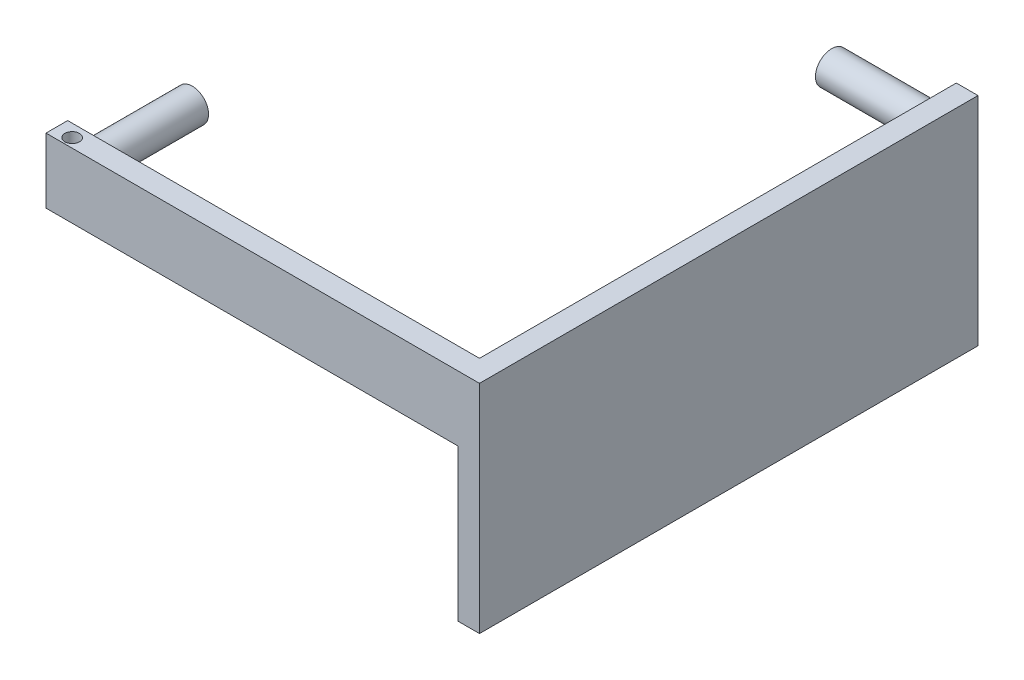
ISO-10303-21;
HEADER;
FILE_DESCRIPTION(('STEP AP214'),'2;1');
FILE_NAME('part.step','',(''),(''),'','','');
FILE_SCHEMA(('AUTOMOTIVE_DESIGN { 1 0 10303 214 1 1 1 1 }'));
ENDSEC;
DATA;
#1=APPLICATION_CONTEXT('core data for automotive mechanical design processes');
#2=APPLICATION_PROTOCOL_DEFINITION('international standard','automotive_design',2000,#1);
#3=PRODUCT_CONTEXT('',#1,'mechanical');
#4=PRODUCT('Part','Part','',(#3));
#5=PRODUCT_RELATED_PRODUCT_CATEGORY('part','',(#4));
#6=PRODUCT_DEFINITION_FORMATION('','',#4);
#7=PRODUCT_DEFINITION_CONTEXT('part definition',#1,'design');
#8=PRODUCT_DEFINITION('design','',#6,#7);
#9=PRODUCT_DEFINITION_SHAPE('','',#8);
#10=(LENGTH_UNIT() NAMED_UNIT(*) SI_UNIT(.MILLI.,.METRE.));
#11=(NAMED_UNIT(*) PLANE_ANGLE_UNIT() SI_UNIT($,.RADIAN.));
#12=(NAMED_UNIT(*) SI_UNIT($,.STERADIAN.) SOLID_ANGLE_UNIT());
#13=UNCERTAINTY_MEASURE_WITH_UNIT(LENGTH_MEASURE(1.E-05),#10,'distance_accuracy_value','');
#14=(GEOMETRIC_REPRESENTATION_CONTEXT(3) GLOBAL_UNCERTAINTY_ASSIGNED_CONTEXT((#13)) GLOBAL_UNIT_ASSIGNED_CONTEXT((#10,
#11,#12)) REPRESENTATION_CONTEXT('',''));
#15=CARTESIAN_POINT('',(0.,0.,0.));
#16=DIRECTION('',(0.,0.,1.));
#17=DIRECTION('',(1.,0.,0.));
#18=AXIS2_PLACEMENT_3D('',#15,#16,#17);
#19=CARTESIAN_POINT('',(0.,30.,0.));
#20=DIRECTION('',(1.,0.,0.));
#21=DIRECTION('',(0.,0.,-1.));
#22=AXIS2_PLACEMENT_3D('',#19,#20,#21);
#23=PLANE('',#22);
#24=DIRECTION('',(0.,0.,1.));
#25=VECTOR('',#24,1.);
#26=CARTESIAN_POINT('',(0.,0.,0.));
#27=LINE('',#26,#25);
#28=CARTESIAN_POINT('',(0.,0.,-10.));
#29=VERTEX_POINT('',#28);
#30=CARTESIAN_POINT('',(0.,0.,0.));
#31=VERTEX_POINT('',#30);
#32=EDGE_CURVE('E117',#29,#31,#27,.T.);
#33=ORIENTED_EDGE('',*,*,#32,.T.);
#34=DIRECTION('',(0.,-1.,0.));
#35=VECTOR('',#34,1.);
#36=CARTESIAN_POINT('',(0.,30.,0.));
#37=LINE('',#36,#35);
#38=CARTESIAN_POINT('',(0.,30.,0.));
#39=VERTEX_POINT('',#38);
#40=EDGE_CURVE('E11',#39,#31,#37,.T.);
#41=ORIENTED_EDGE('',*,*,#40,.F.);
#42=DIRECTION('',(0.,0.,1.));
#43=VECTOR('',#42,1.);
#44=CARTESIAN_POINT('',(0.,30.,0.));
#45=LINE('',#44,#43);
#46=CARTESIAN_POINT('',(0.,30.,-10.));
#47=VERTEX_POINT('',#46);
#48=EDGE_CURVE('E125',#47,#39,#45,.T.);
#49=ORIENTED_EDGE('',*,*,#48,.F.);
#50=DIRECTION('',(0.,-1.,0.));
#51=VECTOR('',#50,1.);
#52=CARTESIAN_POINT('',(0.,30.,-10.));
#53=LINE('',#52,#51);
#54=CARTESIAN_POINT('',(0.,15.,-10.));
#55=VERTEX_POINT('',#54);
#56=EDGE_CURVE('E69',#47,#55,#53,.T.);
#57=ORIENTED_EDGE('',*,*,#56,.T.);
#58=EDGE_CURVE('E113',#55,#29,#53,.T.);
#59=ORIENTED_EDGE('',*,*,#58,.T.);
#60=EDGE_LOOP('',(#33,#41,#49,#57,#59));
#61=FACE_BOUND('',#60,.T.);
#62=ADVANCED_FACE('F33',(#61),#23,.F.);
#63=CARTESIAN_POINT('',(0.,30.,0.));
#64=DIRECTION('',(0.,0.,-1.));
#65=DIRECTION('',(-1.,0.,0.));
#66=AXIS2_PLACEMENT_3D('',#63,#64,#65);
#67=PLANE('',#66);
#68=DIRECTION('',(1.,0.,0.));
#69=VECTOR('',#68,1.);
#70=CARTESIAN_POINT('',(0.,0.,0.));
#71=LINE('',#70,#69);
#72=CARTESIAN_POINT('',(190.,0.,0.));
#73=VERTEX_POINT('',#72);
#74=EDGE_CURVE('E61',#31,#73,#71,.T.);
#75=ORIENTED_EDGE('',*,*,#74,.T.);
#76=DIRECTION('',(0.,-1.,0.));
#77=VECTOR('',#76,1.);
#78=CARTESIAN_POINT('',(190.,30.,0.));
#79=LINE('',#78,#77);
#80=CARTESIAN_POINT('',(190.,-70.,0.));
#81=VERTEX_POINT('',#80);
#82=EDGE_CURVE('E156',#73,#81,#79,.T.);
#83=ORIENTED_EDGE('',*,*,#82,.T.);
#84=DIRECTION('',(1.,0.,0.));
#85=VECTOR('',#84,1.);
#86=CARTESIAN_POINT('',(190.,-70.,0.));
#87=LINE('',#86,#85);
#88=CARTESIAN_POINT('',(200.,-70.,0.));
#89=VERTEX_POINT('',#88);
#90=EDGE_CURVE('E147',#81,#89,#87,.T.);
#91=ORIENTED_EDGE('',*,*,#90,.T.);
#92=DIRECTION('',(0.,-1.,0.));
#93=VECTOR('',#92,1.);
#94=CARTESIAN_POINT('',(200.,30.,0.));
#95=LINE('',#94,#93);
#96=CARTESIAN_POINT('',(200.,30.,0.));
#97=VERTEX_POINT('',#96);
#98=EDGE_CURVE('E41',#97,#89,#95,.T.);
#99=ORIENTED_EDGE('',*,*,#98,.F.);
#100=DIRECTION('',(1.,0.,0.));
#101=VECTOR('',#100,1.);
#102=CARTESIAN_POINT('',(0.,30.,0.));
#103=LINE('',#102,#101);
#104=EDGE_CURVE('E177',#39,#97,#103,.T.);
#105=ORIENTED_EDGE('',*,*,#104,.F.);
#106=ORIENTED_EDGE('',*,*,#40,.T.);
#107=EDGE_LOOP('',(#75,#83,#91,#99,#105,#106));
#108=FACE_BOUND('',#107,.T.);
#109=ADVANCED_FACE('F154',(#108),#67,.F.);
#110=CARTESIAN_POINT('',(200.,30.,0.));
#111=DIRECTION('',(-1.,0.,0.));
#112=DIRECTION('',(0.,0.,1.));
#113=AXIS2_PLACEMENT_3D('',#110,#111,#112);
#114=PLANE('',#113);
#115=ORIENTED_EDGE('',*,*,#98,.T.);
#116=DIRECTION('',(0.,0.,1.));
#117=VECTOR('',#116,1.);
#118=CARTESIAN_POINT('',(200.,-70.,-230.));
#119=LINE('',#118,#117);
#120=CARTESIAN_POINT('',(200.,-70.,-230.));
#121=VERTEX_POINT('',#120);
#122=EDGE_CURVE('E136',#121,#89,#119,.T.);
#123=ORIENTED_EDGE('',*,*,#122,.F.);
#124=DIRECTION('',(0.,-1.,0.));
#125=VECTOR('',#124,1.);
#126=CARTESIAN_POINT('',(200.,30.,-230.));
#127=LINE('',#126,#125);
#128=CARTESIAN_POINT('',(200.,30.,-230.));
#129=VERTEX_POINT('',#128);
#130=EDGE_CURVE('E105',#129,#121,#127,.T.);
#131=ORIENTED_EDGE('',*,*,#130,.F.);
#132=DIRECTION('',(0.,0.,-1.));
#133=VECTOR('',#132,1.);
#134=CARTESIAN_POINT('',(200.,30.,0.));
#135=LINE('',#134,#133);
#136=EDGE_CURVE('E92',#97,#129,#135,.T.);
#137=ORIENTED_EDGE('',*,*,#136,.F.);
#138=EDGE_LOOP('',(#115,#123,#131,#137));
#139=FACE_BOUND('',#138,.T.);
#140=ADVANCED_FACE('F134',(#139),#114,.F.);
#141=CARTESIAN_POINT('',(200.,30.,-230.));
#142=DIRECTION('',(0.,0.,1.));
#143=DIRECTION('',(1.,0.,0.));
#144=AXIS2_PLACEMENT_3D('',#141,#142,#143);
#145=PLANE('',#144);
#146=ORIENTED_EDGE('',*,*,#130,.T.);
#147=DIRECTION('',(1.,0.,0.));
#148=VECTOR('',#147,1.);
#149=CARTESIAN_POINT('',(190.,-70.,-230.));
#150=LINE('',#149,#148);
#151=CARTESIAN_POINT('',(190.,-70.,-230.));
#152=VERTEX_POINT('',#151);
#153=EDGE_CURVE('E149',#152,#121,#150,.T.);
#154=ORIENTED_EDGE('',*,*,#153,.F.);
#155=DIRECTION('',(0.,-1.,0.));
#156=VECTOR('',#155,1.);
#157=CARTESIAN_POINT('',(190.,30.,-230.));
#158=LINE('',#157,#156);
#159=CARTESIAN_POINT('',(190.,-55.,-230.));
#160=VERTEX_POINT('',#159);
#161=EDGE_CURVE('E107',#160,#152,#158,.T.);
#162=ORIENTED_EDGE('',*,*,#161,.F.);
#163=CARTESIAN_POINT('',(190.,15.,-230.));
#164=VERTEX_POINT('',#163);
#165=EDGE_CURVE('E102',#164,#160,#158,.T.);
#166=ORIENTED_EDGE('',*,*,#165,.F.);
#167=CARTESIAN_POINT('',(190.,30.,-230.));
#168=VERTEX_POINT('',#167);
#169=EDGE_CURVE('E98',#168,#164,#158,.T.);
#170=ORIENTED_EDGE('',*,*,#169,.F.);
#171=DIRECTION('',(-1.,0.,0.));
#172=VECTOR('',#171,1.);
#173=CARTESIAN_POINT('',(200.,30.,-230.));
#174=LINE('',#173,#172);
#175=EDGE_CURVE('E85',#129,#168,#174,.T.);
#176=ORIENTED_EDGE('',*,*,#175,.F.);
#177=EDGE_LOOP('',(#146,#154,#162,#166,#170,#176));
#178=FACE_BOUND('',#177,.T.);
#179=ADVANCED_FACE('F99',(#178),#145,.F.);
#180=CARTESIAN_POINT('',(190.,30.,-10.));
#181=DIRECTION('',(1.,0.,0.));
#182=DIRECTION('',(0.,0.,-1.));
#183=AXIS2_PLACEMENT_3D('',#180,#181,#182);
#184=PLANE('',#183);
#185=ORIENTED_EDGE('',*,*,#165,.T.);
#186=CARTESIAN_POINT('',(190.,-55.,-222.5));
#187=DIRECTION('',(-1.,0.,0.));
#188=DIRECTION('',(0.,0.,1.));
#189=AXIS2_PLACEMENT_3D('',#186,#187,#188);
#190=CIRCLE('',#189,7.50000000000001);
#191=EDGE_CURVE('E228',#160,#160,#190,.T.);
#192=ORIENTED_EDGE('',*,*,#191,.F.);
#193=ORIENTED_EDGE('',*,*,#161,.T.);
#194=DIRECTION('',(0.,0.,1.));
#195=VECTOR('',#194,1.);
#196=CARTESIAN_POINT('',(190.,-70.,-230.));
#197=LINE('',#196,#195);
#198=EDGE_CURVE('E151',#152,#81,#197,.T.);
#199=ORIENTED_EDGE('',*,*,#198,.T.);
#200=ORIENTED_EDGE('',*,*,#82,.F.);
#201=DIRECTION('',(0.,0.,-1.));
#202=VECTOR('',#201,1.);
#203=CARTESIAN_POINT('',(190.,0.,0.));
#204=LINE('',#203,#202);
#205=CARTESIAN_POINT('',(190.,0.,-10.));
#206=VERTEX_POINT('',#205);
#207=EDGE_CURVE('E150',#73,#206,#204,.T.);
#208=ORIENTED_EDGE('',*,*,#207,.T.);
#209=DIRECTION('',(0.,-1.,0.));
#210=VECTOR('',#209,1.);
#211=CARTESIAN_POINT('',(190.,30.,-10.));
#212=LINE('',#211,#210);
#213=CARTESIAN_POINT('',(190.,30.,-10.));
#214=VERTEX_POINT('',#213);
#215=EDGE_CURVE('E111',#214,#206,#212,.T.);
#216=ORIENTED_EDGE('',*,*,#215,.F.);
#217=DIRECTION('',(0.,0.,1.));
#218=VECTOR('',#217,1.);
#219=CARTESIAN_POINT('',(190.,30.,-10.));
#220=LINE('',#219,#218);
#221=EDGE_CURVE('E89',#168,#214,#220,.T.);
#222=ORIENTED_EDGE('',*,*,#221,.F.);
#223=ORIENTED_EDGE('',*,*,#169,.T.);
#224=CARTESIAN_POINT('',(190.,15.,-222.5));
#225=DIRECTION('',(-1.,0.,0.));
#226=DIRECTION('',(0.,0.,1.));
#227=AXIS2_PLACEMENT_3D('',#224,#225,#226);
#228=CIRCLE('',#227,7.50000000000001);
#229=EDGE_CURVE('E165',#164,#164,#228,.T.);
#230=ORIENTED_EDGE('',*,*,#229,.F.);
#231=EDGE_LOOP('',(#185,#192,#193,#199,#200,#208,#216,#222,#223,#230));
#232=FACE_BOUND('',#231,.T.);
#233=ADVANCED_FACE('F108',(#232),#184,.F.);
#234=CARTESIAN_POINT('',(0.,30.,-10.));
#235=DIRECTION('',(0.,0.,1.));
#236=DIRECTION('',(1.,0.,0.));
#237=AXIS2_PLACEMENT_3D('',#234,#235,#236);
#238=PLANE('',#237);
#239=ORIENTED_EDGE('',*,*,#58,.F.);
#240=CARTESIAN_POINT('',(7.5,15.,-10.));
#241=DIRECTION('',(0.,0.,-1.));
#242=DIRECTION('',(-1.,0.,0.));
#243=AXIS2_PLACEMENT_3D('',#240,#241,#242);
#244=CIRCLE('',#243,7.5);
#245=EDGE_CURVE('E169',#55,#55,#244,.T.);
#246=ORIENTED_EDGE('',*,*,#245,.F.);
#247=ORIENTED_EDGE('',*,*,#56,.F.);
#248=DIRECTION('',(-1.,0.,0.));
#249=VECTOR('',#248,1.);
#250=CARTESIAN_POINT('',(0.,30.,-10.));
#251=LINE('',#250,#249);
#252=EDGE_CURVE('E49',#214,#47,#251,.T.);
#253=ORIENTED_EDGE('',*,*,#252,.F.);
#254=ORIENTED_EDGE('',*,*,#215,.T.);
#255=DIRECTION('',(-1.,0.,0.));
#256=VECTOR('',#255,1.);
#257=CARTESIAN_POINT('',(0.,0.,-10.));
#258=LINE('',#257,#256);
#259=EDGE_CURVE('E122',#206,#29,#258,.T.);
#260=ORIENTED_EDGE('',*,*,#259,.T.);
#261=EDGE_LOOP('',(#239,#246,#247,#253,#254,#260));
#262=FACE_BOUND('',#261,.T.);
#263=ADVANCED_FACE('F183',(#262),#238,.F.);
#264=CARTESIAN_POINT('',(0.,30.,0.));
#265=DIRECTION('',(0.,-1.,0.));
#266=DIRECTION('',(0.,0.,-1.));
#267=AXIS2_PLACEMENT_3D('',#264,#265,#266);
#268=PLANE('',#267);
#269=CARTESIAN_POINT('',(7.83146153392984,30.,-4.21629196651603));
#270=DIRECTION('',(0.,1.,0.));
#271=DIRECTION('',(0.,0.,1.));
#272=AXIS2_PLACEMENT_3D('',#269,#270,#271);
#273=CIRCLE('',#272,3.37834125745915);
#274=CARTESIAN_POINT('',(7.83146153392984,30.,-0.83795070905688));
#275=VERTEX_POINT('',#274);
#276=EDGE_CURVE('E223',#275,#275,#273,.T.);
#277=ORIENTED_EDGE('',*,*,#276,.F.);
#278=EDGE_LOOP('',(#277));
#279=FACE_BOUND('',#278,.T.);
#280=ORIENTED_EDGE('',*,*,#104,.T.);
#281=ORIENTED_EDGE('',*,*,#136,.T.);
#282=ORIENTED_EDGE('',*,*,#175,.T.);
#283=ORIENTED_EDGE('',*,*,#221,.T.);
#284=ORIENTED_EDGE('',*,*,#252,.T.);
#285=ORIENTED_EDGE('',*,*,#48,.T.);
#286=EDGE_LOOP('',(#280,#281,#282,#283,#284,#285));
#287=FACE_BOUND('',#286,.T.);
#288=ADVANCED_FACE('F87',(#279,#287),#268,.F.);
#289=CARTESIAN_POINT('',(0.,0.,0.));
#290=DIRECTION('',(0.,-1.,0.));
#291=DIRECTION('',(0.,0.,-1.));
#292=AXIS2_PLACEMENT_3D('',#289,#290,#291);
#293=PLANE('',#292);
#294=ORIENTED_EDGE('',*,*,#207,.F.);
#295=ORIENTED_EDGE('',*,*,#74,.F.);
#296=ORIENTED_EDGE('',*,*,#32,.F.);
#297=ORIENTED_EDGE('',*,*,#259,.F.);
#298=EDGE_LOOP('',(#294,#295,#296,#297));
#299=FACE_BOUND('',#298,.T.);
#300=ADVANCED_FACE('F181',(#299),#293,.T.);
#301=CARTESIAN_POINT('',(7.5,15.,-60.));
#302=DIRECTION('',(0.,0.,1.));
#303=DIRECTION('',(1.,0.,0.));
#304=AXIS2_PLACEMENT_3D('',#301,#302,#303);
#305=CYLINDRICAL_SURFACE('',#304,7.5);
#306=CARTESIAN_POINT('',(7.5,15.,-60.));
#307=DIRECTION('',(0.,0.,-1.));
#308=DIRECTION('',(-1.,0.,0.));
#309=AXIS2_PLACEMENT_3D('',#306,#307,#308);
#310=CIRCLE('',#309,7.5);
#311=CARTESIAN_POINT('',(0.,15.,-60.));
#312=VERTEX_POINT('',#311);
#313=EDGE_CURVE('E120',#312,#312,#310,.T.);
#314=ORIENTED_EDGE('',*,*,#313,.F.);
#315=EDGE_LOOP('',(#314));
#316=FACE_BOUND('',#315,.T.);
#317=ORIENTED_EDGE('',*,*,#245,.T.);
#318=EDGE_LOOP('',(#317));
#319=FACE_BOUND('',#318,.T.);
#320=ADVANCED_FACE('F186',(#316,#319),#305,.T.);
#321=CARTESIAN_POINT('',(7.5,15.,-60.));
#322=DIRECTION('',(0.,0.,-1.));
#323=DIRECTION('',(-1.,0.,0.));
#324=AXIS2_PLACEMENT_3D('',#321,#322,#323);
#325=PLANE('',#324);
#326=ORIENTED_EDGE('',*,*,#313,.T.);
#327=EDGE_LOOP('',(#326));
#328=FACE_BOUND('',#327,.T.);
#329=ADVANCED_FACE('F188',(#328),#325,.T.);
#330=CARTESIAN_POINT('',(140.,15.,-222.5));
#331=DIRECTION('',(1.,0.,0.));
#332=DIRECTION('',(0.,0.,-1.));
#333=AXIS2_PLACEMENT_3D('',#330,#331,#332);
#334=CYLINDRICAL_SURFACE('',#333,7.50000000000001);
#335=CARTESIAN_POINT('',(140.,15.,-222.5));
#336=DIRECTION('',(-1.,0.,0.));
#337=DIRECTION('',(0.,0.,1.));
#338=AXIS2_PLACEMENT_3D('',#335,#336,#337);
#339=CIRCLE('',#338,7.50000000000001);
#340=CARTESIAN_POINT('',(140.,15.,-215.));
#341=VERTEX_POINT('',#340);
#342=EDGE_CURVE('E166',#341,#341,#339,.T.);
#343=ORIENTED_EDGE('',*,*,#342,.F.);
#344=EDGE_LOOP('',(#343));
#345=FACE_BOUND('',#344,.T.);
#346=ORIENTED_EDGE('',*,*,#229,.T.);
#347=EDGE_LOOP('',(#346));
#348=FACE_BOUND('',#347,.T.);
#349=ADVANCED_FACE('F195',(#345,#348),#334,.T.);
#350=CARTESIAN_POINT('',(140.,15.,-222.5));
#351=DIRECTION('',(-1.,0.,0.));
#352=DIRECTION('',(0.,0.,1.));
#353=AXIS2_PLACEMENT_3D('',#350,#351,#352);
#354=PLANE('',#353);
#355=ORIENTED_EDGE('',*,*,#342,.T.);
#356=EDGE_LOOP('',(#355));
#357=FACE_BOUND('',#356,.T.);
#358=ADVANCED_FACE('F246',(#357),#354,.T.);
#359=CARTESIAN_POINT('',(190.,-70.,-230.));
#360=DIRECTION('',(0.,-1.,0.));
#361=DIRECTION('',(1.,0.,0.));
#362=AXIS2_PLACEMENT_3D('',#359,#360,#361);
#363=PLANE('',#362);
#364=ORIENTED_EDGE('',*,*,#90,.F.);
#365=ORIENTED_EDGE('',*,*,#198,.F.);
#366=ORIENTED_EDGE('',*,*,#153,.T.);
#367=ORIENTED_EDGE('',*,*,#122,.T.);
#368=EDGE_LOOP('',(#364,#365,#366,#367));
#369=FACE_BOUND('',#368,.T.);
#370=ADVANCED_FACE('F145',(#369),#363,.T.);
#371=CARTESIAN_POINT('',(140.,-55.,-222.5));
#372=DIRECTION('',(1.,0.,0.));
#373=DIRECTION('',(0.,0.,-1.));
#374=AXIS2_PLACEMENT_3D('',#371,#372,#373);
#375=CYLINDRICAL_SURFACE('',#374,7.50000000000001);
#376=CARTESIAN_POINT('',(140.,-55.,-222.5));
#377=DIRECTION('',(-1.,0.,0.));
#378=DIRECTION('',(0.,0.,1.));
#379=AXIS2_PLACEMENT_3D('',#376,#377,#378);
#380=CIRCLE('',#379,7.50000000000001);
#381=CARTESIAN_POINT('',(140.,-55.,-215.));
#382=VERTEX_POINT('',#381);
#383=EDGE_CURVE('E160',#382,#382,#380,.T.);
#384=ORIENTED_EDGE('',*,*,#383,.F.);
#385=EDGE_LOOP('',(#384));
#386=FACE_BOUND('',#385,.T.);
#387=ORIENTED_EDGE('',*,*,#191,.T.);
#388=EDGE_LOOP('',(#387));
#389=FACE_BOUND('',#388,.T.);
#390=ADVANCED_FACE('F237',(#386,#389),#375,.T.);
#391=CARTESIAN_POINT('',(140.,-55.,-222.5));
#392=DIRECTION('',(-1.,0.,0.));
#393=DIRECTION('',(0.,0.,1.));
#394=AXIS2_PLACEMENT_3D('',#391,#392,#393);
#395=PLANE('',#394);
#396=ORIENTED_EDGE('',*,*,#383,.T.);
#397=EDGE_LOOP('',(#396));
#398=FACE_BOUND('',#397,.T.);
#399=ADVANCED_FACE('F260',(#398),#395,.T.);
#400=CARTESIAN_POINT('',(7.83146153392984,20.,-4.21629196651603));
#401=DIRECTION('',(0.,1.,0.));
#402=DIRECTION('',(0.,0.,1.));
#403=AXIS2_PLACEMENT_3D('',#400,#401,#402);
#404=CYLINDRICAL_SURFACE('',#403,3.37834125745915);
#405=CARTESIAN_POINT('',(7.83146153392984,20.,-4.21629196651603));
#406=DIRECTION('',(0.,1.,0.));
#407=DIRECTION('',(0.,0.,1.));
#408=AXIS2_PLACEMENT_3D('',#405,#406,#407);
#409=CIRCLE('',#408,3.37834125745915);
#410=CARTESIAN_POINT('',(7.83146153392984,20.,-0.83795070905688));
#411=VERTEX_POINT('',#410);
#412=EDGE_CURVE('E225',#411,#411,#409,.T.);
#413=ORIENTED_EDGE('',*,*,#412,.F.);
#414=EDGE_LOOP('',(#413));
#415=FACE_BOUND('',#414,.T.);
#416=ORIENTED_EDGE('',*,*,#276,.T.);
#417=EDGE_LOOP('',(#416));
#418=FACE_BOUND('',#417,.T.);
#419=ADVANCED_FACE('F264',(#415,#418),#404,.F.);
#420=CARTESIAN_POINT('',(7.83146153392984,20.,-4.21629196651603));
#421=DIRECTION('',(0.,1.,0.));
#422=DIRECTION('',(0.,0.,1.));
#423=AXIS2_PLACEMENT_3D('',#420,#421,#422);
#424=PLANE('',#423);
#425=ORIENTED_EDGE('',*,*,#412,.T.);
#426=EDGE_LOOP('',(#425));
#427=FACE_BOUND('',#426,.T.);
#428=ADVANCED_FACE('F268',(#427),#424,.T.);
#429=CLOSED_SHELL('',(#62,#109,#140,#179,#233,#263,#288,#300,#320,#329,#349,#358,#370,#390,#399,
#419,#428));
#430=MANIFOLD_SOLID_BREP('B2',#429);
#431=ADVANCED_BREP_SHAPE_REPRESENTATION('',(#18,#430),#14);
#432=SHAPE_DEFINITION_REPRESENTATION(#9,#431);
ENDSEC;
END-ISO-10303-21;
